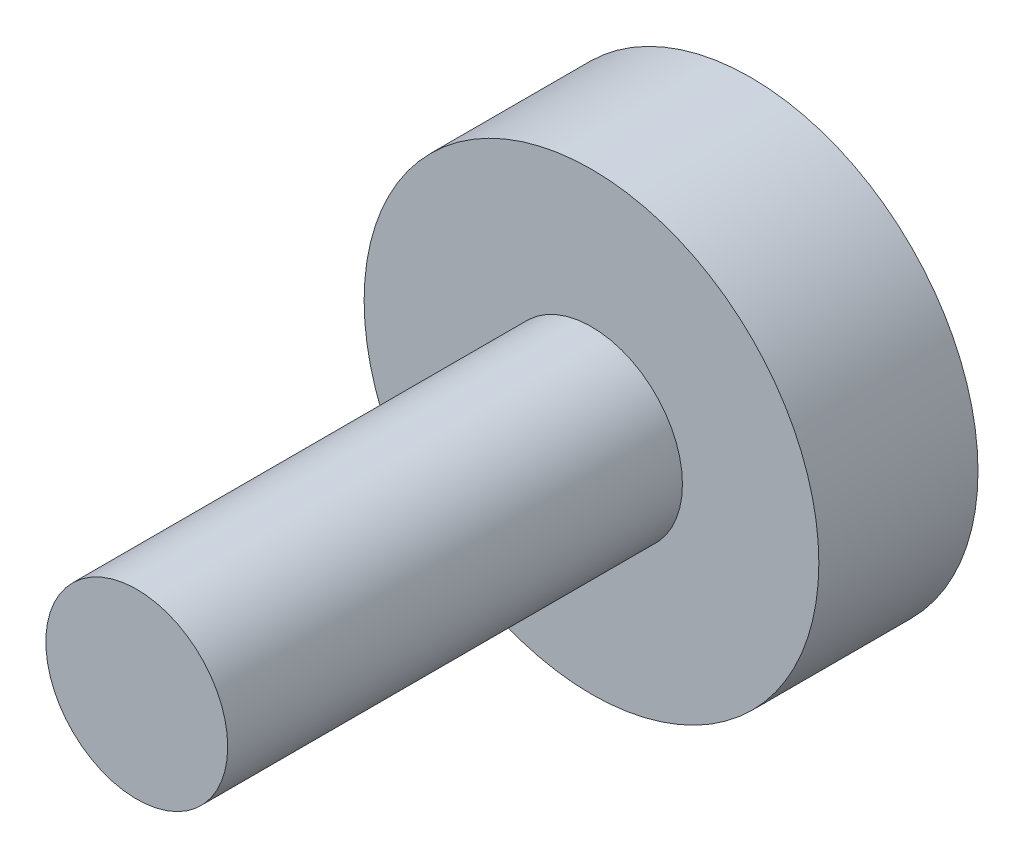
ISO-10303-21;
HEADER;
FILE_DESCRIPTION(('STEP AP214'),'2;1');
FILE_NAME('part.step','',(''),(''),'','','');
FILE_SCHEMA(('AUTOMOTIVE_DESIGN { 1 0 10303 214 1 1 1 1 }'));
ENDSEC;
DATA;
#1=APPLICATION_CONTEXT('core data for automotive mechanical design processes');
#2=APPLICATION_PROTOCOL_DEFINITION('international standard','automotive_design',2000,#1);
#3=PRODUCT_CONTEXT('',#1,'mechanical');
#4=PRODUCT('Part','Part','',(#3));
#5=PRODUCT_RELATED_PRODUCT_CATEGORY('part','',(#4));
#6=PRODUCT_DEFINITION_FORMATION('','',#4);
#7=PRODUCT_DEFINITION_CONTEXT('part definition',#1,'design');
#8=PRODUCT_DEFINITION('design','',#6,#7);
#9=PRODUCT_DEFINITION_SHAPE('','',#8);
#10=(LENGTH_UNIT() NAMED_UNIT(*) SI_UNIT(.MILLI.,.METRE.));
#11=(NAMED_UNIT(*) PLANE_ANGLE_UNIT() SI_UNIT($,.RADIAN.));
#12=(NAMED_UNIT(*) SI_UNIT($,.STERADIAN.) SOLID_ANGLE_UNIT());
#13=UNCERTAINTY_MEASURE_WITH_UNIT(LENGTH_MEASURE(1.E-05),#10,'distance_accuracy_value','');
#14=(GEOMETRIC_REPRESENTATION_CONTEXT(3) GLOBAL_UNCERTAINTY_ASSIGNED_CONTEXT((#13)) GLOBAL_UNIT_ASSIGNED_CONTEXT((#10,
#11,#12)) REPRESENTATION_CONTEXT('',''));
#15=CARTESIAN_POINT('',(0.,0.,0.));
#16=DIRECTION('',(0.,0.,1.));
#17=DIRECTION('',(1.,0.,0.));
#18=AXIS2_PLACEMENT_3D('',#15,#16,#17);
#19=CARTESIAN_POINT('',(0.,0.,7.));
#20=DIRECTION('',(0.,0.,-1.));
#21=DIRECTION('',(-1.,0.,0.));
#22=AXIS2_PLACEMENT_3D('',#19,#20,#21);
#23=CYLINDRICAL_SURFACE('',#22,10.);
#24=CARTESIAN_POINT('',(0.,0.,7.));
#25=DIRECTION('',(0.,0.,1.));
#26=DIRECTION('',(1.,0.,0.));
#27=AXIS2_PLACEMENT_3D('',#24,#25,#26);
#28=CIRCLE('',#27,10.);
#29=CARTESIAN_POINT('',(10.,0.,7.));
#30=VERTEX_POINT('',#29);
#31=EDGE_CURVE('E42',#30,#30,#28,.T.);
#32=ORIENTED_EDGE('',*,*,#31,.F.);
#33=EDGE_LOOP('',(#32));
#34=FACE_BOUND('',#33,.T.);
#35=CARTESIAN_POINT('',(0.,0.,0.));
#36=DIRECTION('',(0.,0.,1.));
#37=DIRECTION('',(1.,0.,0.));
#38=AXIS2_PLACEMENT_3D('',#35,#36,#37);
#39=CIRCLE('',#38,10.);
#40=CARTESIAN_POINT('',(10.,0.,0.));
#41=VERTEX_POINT('',#40);
#42=EDGE_CURVE('E38',#41,#41,#39,.T.);
#43=ORIENTED_EDGE('',*,*,#42,.T.);
#44=EDGE_LOOP('',(#43));
#45=FACE_BOUND('',#44,.T.);
#46=ADVANCED_FACE('F35',(#34,#45),#23,.T.);
#47=CARTESIAN_POINT('',(0.,0.,7.));
#48=DIRECTION('',(0.,0.,1.));
#49=DIRECTION('',(1.,0.,0.));
#50=AXIS2_PLACEMENT_3D('',#47,#48,#49);
#51=PLANE('',#50);
#52=CARTESIAN_POINT('',(0.,0.,7.));
#53=DIRECTION('',(0.,0.,1.));
#54=DIRECTION('',(1.,0.,0.));
#55=AXIS2_PLACEMENT_3D('',#52,#53,#54);
#56=CIRCLE('',#55,4.);
#57=CARTESIAN_POINT('',(4.,0.,7.));
#58=VERTEX_POINT('',#57);
#59=EDGE_CURVE('E10',#58,#58,#56,.T.);
#60=ORIENTED_EDGE('',*,*,#59,.F.);
#61=EDGE_LOOP('',(#60));
#62=FACE_BOUND('',#61,.T.);
#63=ORIENTED_EDGE('',*,*,#31,.T.);
#64=EDGE_LOOP('',(#63));
#65=FACE_BOUND('',#64,.T.);
#66=ADVANCED_FACE('F59',(#62,#65),#51,.T.);
#67=CARTESIAN_POINT('',(0.,0.,0.));
#68=DIRECTION('',(0.,0.,1.));
#69=DIRECTION('',(1.,0.,0.));
#70=AXIS2_PLACEMENT_3D('',#67,#68,#69);
#71=PLANE('',#70);
#72=ORIENTED_EDGE('',*,*,#42,.F.);
#73=EDGE_LOOP('',(#72));
#74=FACE_BOUND('',#73,.T.);
#75=ADVANCED_FACE('F56',(#74),#71,.F.);
#76=CARTESIAN_POINT('',(0.,0.,27.));
#77=DIRECTION('',(0.,0.,-1.));
#78=DIRECTION('',(-1.,0.,0.));
#79=AXIS2_PLACEMENT_3D('',#76,#77,#78);
#80=CYLINDRICAL_SURFACE('',#79,4.);
#81=CARTESIAN_POINT('',(0.,0.,27.));
#82=DIRECTION('',(0.,0.,1.));
#83=DIRECTION('',(1.,0.,0.));
#84=AXIS2_PLACEMENT_3D('',#81,#82,#83);
#85=CIRCLE('',#84,4.);
#86=CARTESIAN_POINT('',(4.,0.,27.));
#87=VERTEX_POINT('',#86);
#88=EDGE_CURVE('E48',#87,#87,#85,.T.);
#89=ORIENTED_EDGE('',*,*,#88,.F.);
#90=EDGE_LOOP('',(#89));
#91=FACE_BOUND('',#90,.T.);
#92=ORIENTED_EDGE('',*,*,#59,.T.);
#93=EDGE_LOOP('',(#92));
#94=FACE_BOUND('',#93,.T.);
#95=ADVANCED_FACE('F58',(#91,#94),#80,.T.);
#96=CARTESIAN_POINT('',(0.,0.,27.));
#97=DIRECTION('',(0.,0.,1.));
#98=DIRECTION('',(1.,0.,0.));
#99=AXIS2_PLACEMENT_3D('',#96,#97,#98);
#100=PLANE('',#99);
#101=ORIENTED_EDGE('',*,*,#88,.T.);
#102=EDGE_LOOP('',(#101));
#103=FACE_BOUND('',#102,.T.);
#104=ADVANCED_FACE('F64',(#103),#100,.T.);
#105=CLOSED_SHELL('',(#46,#66,#75,#95,#104));
#106=MANIFOLD_SOLID_BREP('B2',#105);
#107=ADVANCED_BREP_SHAPE_REPRESENTATION('',(#18,#106),#14);
#108=SHAPE_DEFINITION_REPRESENTATION(#9,#107);
ENDSEC;
END-ISO-10303-21;
